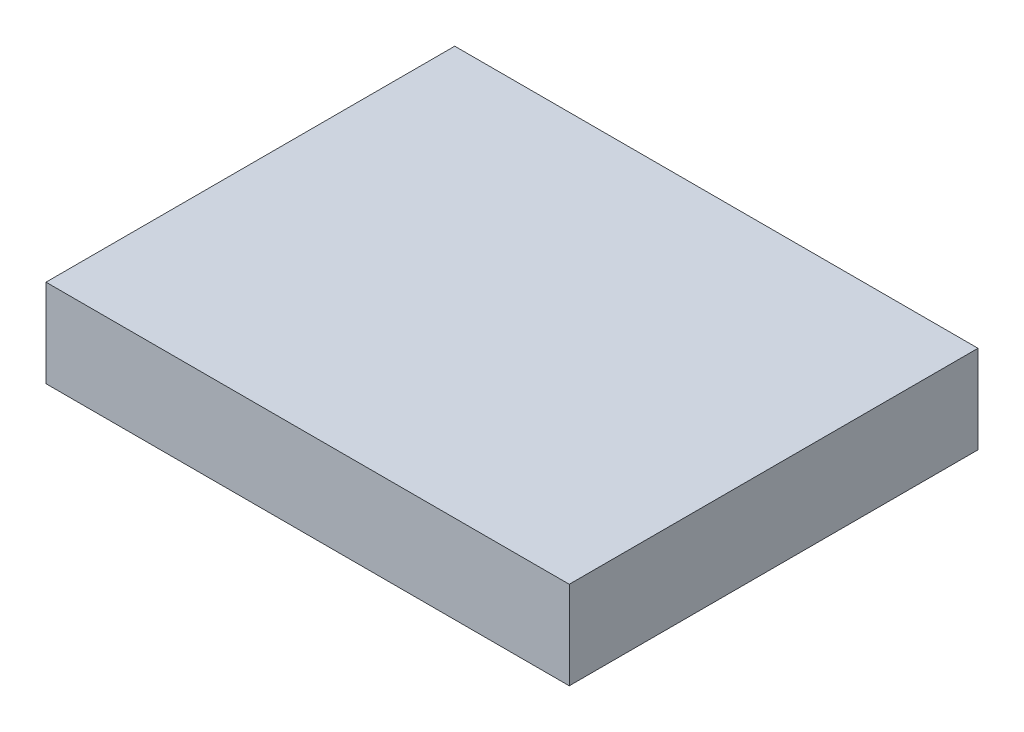
ISO-10303-21;
HEADER;
FILE_DESCRIPTION(('STEP AP214'),'2;1');
FILE_NAME('part.step','',(''),(''),'','','');
FILE_SCHEMA(('AUTOMOTIVE_DESIGN { 1 0 10303 214 1 1 1 1 }'));
ENDSEC;
DATA;
#1=APPLICATION_CONTEXT('core data for automotive mechanical design processes');
#2=APPLICATION_PROTOCOL_DEFINITION('international standard','automotive_design',2000,#1);
#3=PRODUCT_CONTEXT('',#1,'mechanical');
#4=PRODUCT('Part','Part','',(#3));
#5=PRODUCT_RELATED_PRODUCT_CATEGORY('part','',(#4));
#6=PRODUCT_DEFINITION_FORMATION('','',#4);
#7=PRODUCT_DEFINITION_CONTEXT('part definition',#1,'design');
#8=PRODUCT_DEFINITION('design','',#6,#7);
#9=PRODUCT_DEFINITION_SHAPE('','',#8);
#10=(LENGTH_UNIT() NAMED_UNIT(*) SI_UNIT(.MILLI.,.METRE.));
#11=(NAMED_UNIT(*) PLANE_ANGLE_UNIT() SI_UNIT($,.RADIAN.));
#12=(NAMED_UNIT(*) SI_UNIT($,.STERADIAN.) SOLID_ANGLE_UNIT());
#13=UNCERTAINTY_MEASURE_WITH_UNIT(LENGTH_MEASURE(1.E-05),#10,'distance_accuracy_value','');
#14=(GEOMETRIC_REPRESENTATION_CONTEXT(3) GLOBAL_UNCERTAINTY_ASSIGNED_CONTEXT((#13)) GLOBAL_UNIT_ASSIGNED_CONTEXT((#10,
#11,#12)) REPRESENTATION_CONTEXT('',''));
#15=CARTESIAN_POINT('',(0.,0.,0.));
#16=DIRECTION('',(0.,0.,1.));
#17=DIRECTION('',(1.,0.,0.));
#18=AXIS2_PLACEMENT_3D('',#15,#16,#17);
#19=CARTESIAN_POINT('',(34.5,11.6,-26.95));
#20=DIRECTION('',(-1.,0.,0.));
#21=DIRECTION('',(0.,0.,1.));
#22=AXIS2_PLACEMENT_3D('',#19,#20,#21);
#23=PLANE('',#22);
#24=DIRECTION('',(0.,0.,-1.));
#25=VECTOR('',#24,1.);
#26=CARTESIAN_POINT('',(34.5,0.,-26.95));
#27=LINE('',#26,#25);
#28=CARTESIAN_POINT('',(34.5,0.,26.95));
#29=VERTEX_POINT('',#28);
#30=CARTESIAN_POINT('',(34.5,0.,-26.95));
#31=VERTEX_POINT('',#30);
#32=EDGE_CURVE('E95',#29,#31,#27,.T.);
#33=ORIENTED_EDGE('',*,*,#32,.T.);
#34=DIRECTION('',(0.,-1.,0.));
#35=VECTOR('',#34,1.);
#36=CARTESIAN_POINT('',(34.5,11.6,-26.95));
#37=LINE('',#36,#35);
#38=CARTESIAN_POINT('',(34.5,11.6,-26.95));
#39=VERTEX_POINT('',#38);
#40=EDGE_CURVE('E11',#39,#31,#37,.T.);
#41=ORIENTED_EDGE('',*,*,#40,.F.);
#42=DIRECTION('',(0.,0.,-1.));
#43=VECTOR('',#42,1.);
#44=CARTESIAN_POINT('',(34.5,11.6,-26.95));
#45=LINE('',#44,#43);
#46=CARTESIAN_POINT('',(34.5,11.6,26.95));
#47=VERTEX_POINT('',#46);
#48=EDGE_CURVE('E83',#47,#39,#45,.T.);
#49=ORIENTED_EDGE('',*,*,#48,.F.);
#50=DIRECTION('',(0.,-1.,0.));
#51=VECTOR('',#50,1.);
#52=CARTESIAN_POINT('',(34.5,11.6,26.95));
#53=LINE('',#52,#51);
#54=EDGE_CURVE('E91',#47,#29,#53,.T.);
#55=ORIENTED_EDGE('',*,*,#54,.T.);
#56=EDGE_LOOP('',(#33,#41,#49,#55));
#57=FACE_BOUND('',#56,.T.);
#58=ADVANCED_FACE('F32',(#57),#23,.F.);
#59=CARTESIAN_POINT('',(-34.5,11.6,-26.95));
#60=DIRECTION('',(0.,0.,1.));
#61=DIRECTION('',(1.,0.,0.));
#62=AXIS2_PLACEMENT_3D('',#59,#60,#61);
#63=PLANE('',#62);
#64=DIRECTION('',(-1.,0.,0.));
#65=VECTOR('',#64,1.);
#66=CARTESIAN_POINT('',(-34.5,0.,-26.95));
#67=LINE('',#66,#65);
#68=CARTESIAN_POINT('',(-34.5,0.,-26.95));
#69=VERTEX_POINT('',#68);
#70=EDGE_CURVE('E87',#31,#69,#67,.T.);
#71=ORIENTED_EDGE('',*,*,#70,.T.);
#72=DIRECTION('',(0.,-1.,0.));
#73=VECTOR('',#72,1.);
#74=CARTESIAN_POINT('',(-34.5,11.6,-26.95));
#75=LINE('',#74,#73);
#76=CARTESIAN_POINT('',(-34.5,11.6,-26.95));
#77=VERTEX_POINT('',#76);
#78=EDGE_CURVE('E40',#77,#69,#75,.T.);
#79=ORIENTED_EDGE('',*,*,#78,.F.);
#80=DIRECTION('',(-1.,0.,0.));
#81=VECTOR('',#80,1.);
#82=CARTESIAN_POINT('',(-34.5,11.6,-26.95));
#83=LINE('',#82,#81);
#84=EDGE_CURVE('E78',#39,#77,#83,.T.);
#85=ORIENTED_EDGE('',*,*,#84,.F.);
#86=ORIENTED_EDGE('',*,*,#40,.T.);
#87=EDGE_LOOP('',(#71,#79,#85,#86));
#88=FACE_BOUND('',#87,.T.);
#89=ADVANCED_FACE('F86',(#88),#63,.F.);
#90=CARTESIAN_POINT('',(-34.5,11.6,-26.95));
#91=DIRECTION('',(1.,0.,0.));
#92=DIRECTION('',(0.,0.,-1.));
#93=AXIS2_PLACEMENT_3D('',#90,#91,#92);
#94=PLANE('',#93);
#95=DIRECTION('',(0.,0.,1.));
#96=VECTOR('',#95,1.);
#97=CARTESIAN_POINT('',(-34.5,0.,-26.95));
#98=LINE('',#97,#96);
#99=CARTESIAN_POINT('',(-34.5,0.,26.95));
#100=VERTEX_POINT('',#99);
#101=EDGE_CURVE('E65',#69,#100,#98,.T.);
#102=ORIENTED_EDGE('',*,*,#101,.T.);
#103=DIRECTION('',(0.,-1.,0.));
#104=VECTOR('',#103,1.);
#105=CARTESIAN_POINT('',(-34.5,11.6,26.95));
#106=LINE('',#105,#104);
#107=CARTESIAN_POINT('',(-34.5,11.6,26.95));
#108=VERTEX_POINT('',#107);
#109=EDGE_CURVE('E88',#108,#100,#106,.T.);
#110=ORIENTED_EDGE('',*,*,#109,.F.);
#111=DIRECTION('',(0.,0.,1.));
#112=VECTOR('',#111,1.);
#113=CARTESIAN_POINT('',(-34.5,11.6,-26.95));
#114=LINE('',#113,#112);
#115=EDGE_CURVE('E81',#77,#108,#114,.T.);
#116=ORIENTED_EDGE('',*,*,#115,.F.);
#117=ORIENTED_EDGE('',*,*,#78,.T.);
#118=EDGE_LOOP('',(#102,#110,#116,#117));
#119=FACE_BOUND('',#118,.T.);
#120=ADVANCED_FACE('F89',(#119),#94,.F.);
#121=CARTESIAN_POINT('',(-34.5,11.6,26.95));
#122=DIRECTION('',(0.,0.,-1.));
#123=DIRECTION('',(-1.,0.,0.));
#124=AXIS2_PLACEMENT_3D('',#121,#122,#123);
#125=PLANE('',#124);
#126=DIRECTION('',(1.,0.,0.));
#127=VECTOR('',#126,1.);
#128=CARTESIAN_POINT('',(-34.5,0.,26.95));
#129=LINE('',#128,#127);
#130=EDGE_CURVE('E71',#100,#29,#129,.T.);
#131=ORIENTED_EDGE('',*,*,#130,.T.);
#132=ORIENTED_EDGE('',*,*,#54,.F.);
#133=DIRECTION('',(1.,0.,0.));
#134=VECTOR('',#133,1.);
#135=CARTESIAN_POINT('',(-34.5,11.6,26.95));
#136=LINE('',#135,#134);
#137=EDGE_CURVE('E48',#108,#47,#136,.T.);
#138=ORIENTED_EDGE('',*,*,#137,.F.);
#139=ORIENTED_EDGE('',*,*,#109,.T.);
#140=EDGE_LOOP('',(#131,#132,#138,#139));
#141=FACE_BOUND('',#140,.T.);
#142=ADVANCED_FACE('F102',(#141),#125,.F.);
#143=CARTESIAN_POINT('',(0.,11.6,0.));
#144=DIRECTION('',(0.,1.,0.));
#145=DIRECTION('',(0.,0.,1.));
#146=AXIS2_PLACEMENT_3D('',#143,#144,#145);
#147=PLANE('',#146);
#148=ORIENTED_EDGE('',*,*,#48,.T.);
#149=ORIENTED_EDGE('',*,*,#84,.T.);
#150=ORIENTED_EDGE('',*,*,#115,.T.);
#151=ORIENTED_EDGE('',*,*,#137,.T.);
#152=EDGE_LOOP('',(#148,#149,#150,#151));
#153=FACE_BOUND('',#152,.T.);
#154=ADVANCED_FACE('F79',(#153),#147,.T.);
#155=CARTESIAN_POINT('',(0.,0.,0.));
#156=DIRECTION('',(0.,1.,0.));
#157=DIRECTION('',(0.,0.,1.));
#158=AXIS2_PLACEMENT_3D('',#155,#156,#157);
#159=PLANE('',#158);
#160=ORIENTED_EDGE('',*,*,#32,.F.);
#161=ORIENTED_EDGE('',*,*,#130,.F.);
#162=ORIENTED_EDGE('',*,*,#101,.F.);
#163=ORIENTED_EDGE('',*,*,#70,.F.);
#164=EDGE_LOOP('',(#160,#161,#162,#163));
#165=FACE_BOUND('',#164,.T.);
#166=ADVANCED_FACE('F105',(#165),#159,.F.);
#167=CLOSED_SHELL('',(#58,#89,#120,#142,#154,#166));
#168=MANIFOLD_SOLID_BREP('B2',#167);
#169=ADVANCED_BREP_SHAPE_REPRESENTATION('',(#18,#168),#14);
#170=SHAPE_DEFINITION_REPRESENTATION(#9,#169);
ENDSEC;
END-ISO-10303-21;
